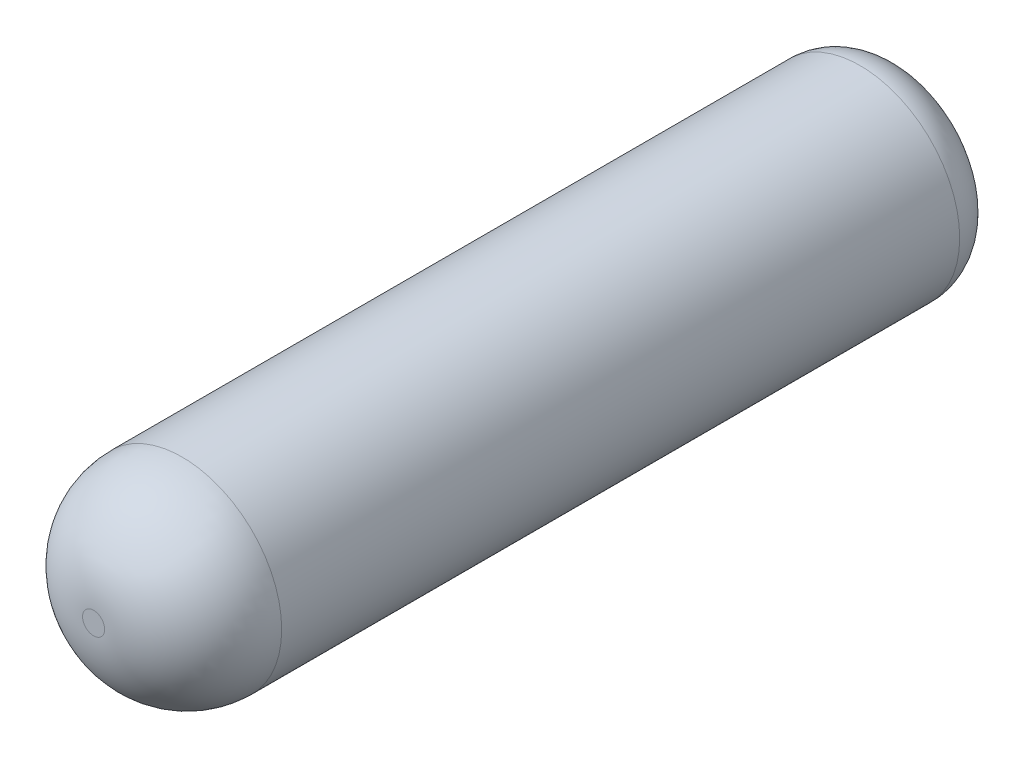
ISO-10303-21;
HEADER;
FILE_DESCRIPTION(('STEP AP214'),'2;1');
FILE_NAME('part.step','',(''),(''),'','','');
FILE_SCHEMA(('AUTOMOTIVE_DESIGN { 1 0 10303 214 1 1 1 1 }'));
ENDSEC;
DATA;
#1=APPLICATION_CONTEXT('core data for automotive mechanical design processes');
#2=APPLICATION_PROTOCOL_DEFINITION('international standard','automotive_design',2000,#1);
#3=PRODUCT_CONTEXT('',#1,'mechanical');
#4=PRODUCT('Part','Part','',(#3));
#5=PRODUCT_RELATED_PRODUCT_CATEGORY('part','',(#4));
#6=PRODUCT_DEFINITION_FORMATION('','',#4);
#7=PRODUCT_DEFINITION_CONTEXT('part definition',#1,'design');
#8=PRODUCT_DEFINITION('design','',#6,#7);
#9=PRODUCT_DEFINITION_SHAPE('','',#8);
#10=(LENGTH_UNIT() NAMED_UNIT(*) SI_UNIT(.MILLI.,.METRE.));
#11=(NAMED_UNIT(*) PLANE_ANGLE_UNIT() SI_UNIT($,.RADIAN.));
#12=(NAMED_UNIT(*) SI_UNIT($,.STERADIAN.) SOLID_ANGLE_UNIT());
#13=UNCERTAINTY_MEASURE_WITH_UNIT(LENGTH_MEASURE(1.E-05),#10,'distance_accuracy_value','');
#14=(GEOMETRIC_REPRESENTATION_CONTEXT(3) GLOBAL_UNCERTAINTY_ASSIGNED_CONTEXT((#13)) GLOBAL_UNIT_ASSIGNED_CONTEXT((#10,
#11,#12)) REPRESENTATION_CONTEXT('',''));
#15=CARTESIAN_POINT('',(0.,0.,0.));
#16=DIRECTION('',(0.,0.,1.));
#17=DIRECTION('',(1.,0.,0.));
#18=AXIS2_PLACEMENT_3D('',#15,#16,#17);
#19=CARTESIAN_POINT('',(0.,0.,116.332));
#20=DIRECTION('',(0.,0.,-1.));
#21=DIRECTION('',(-1.,0.,0.));
#22=AXIS2_PLACEMENT_3D('',#19,#20,#21);
#23=CYLINDRICAL_SURFACE('',#22,14.2875);
#24=CARTESIAN_POINT('',(0.,0.,103.632));
#25=DIRECTION('',(0.,0.,1.));
#26=DIRECTION('',(1.,0.,0.));
#27=AXIS2_PLACEMENT_3D('',#24,#25,#26);
#28=CIRCLE('',#27,14.2875);
#29=CARTESIAN_POINT('',(-14.2875,0.,103.632));
#30=VERTEX_POINT('',#29);
#31=EDGE_CURVE('E10',#30,#30,#28,.F.);
#32=CARTESIAN_POINT('',(0.,0.,6.34999999999997));
#33=DIRECTION('',(0.,0.,1.));
#34=DIRECTION('',(1.,0.,0.));
#35=AXIS2_PLACEMENT_3D('',#32,#33,#34);
#36=CIRCLE('',#35,14.2875);
#37=CARTESIAN_POINT('',(-14.2875,0.,6.34999999999997));
#38=VERTEX_POINT('',#37);
#39=EDGE_CURVE('E61',#38,#38,#36,.T.);
#40=CARTESIAN_POINT('',(-14.2875,0.,103.632));
#41=CARTESIAN_POINT('',(-14.2875,0.,102.618645833333));
#42=CARTESIAN_POINT('',(-14.2875,0.,101.605291666667));
#43=CARTESIAN_POINT('',(-14.2875,0.,99.5785833333333));
#44=CARTESIAN_POINT('',(-14.2875,0.,98.5652291666667));
#45=CARTESIAN_POINT('',(-14.2875,0.,96.5385208333333));
#46=CARTESIAN_POINT('',(-14.2875,0.,95.5251666666667));
#47=CARTESIAN_POINT('',(-14.2875,0.,93.4984583333333));
#48=CARTESIAN_POINT('',(-14.2875,0.,92.4851041666666));
#49=CARTESIAN_POINT('',(-14.2875,0.,90.4583958333333));
#50=CARTESIAN_POINT('',(-14.2875,0.,89.4450416666667));
#51=CARTESIAN_POINT('',(-14.2875,0.,87.4183333333333));
#52=CARTESIAN_POINT('',(-14.2875,0.,86.4049791666667));
#53=CARTESIAN_POINT('',(-14.2875,0.,84.3782708333333));
#54=CARTESIAN_POINT('',(-14.2875,0.,83.3649166666667));
#55=CARTESIAN_POINT('',(-14.2875,0.,81.3382083333333));
#56=CARTESIAN_POINT('',(-14.2875,0.,80.3248541666667));
#57=CARTESIAN_POINT('',(-14.2875,0.,78.2981458333333));
#58=CARTESIAN_POINT('',(-14.2875,0.,77.2847916666666));
#59=CARTESIAN_POINT('',(-14.2875,0.,75.2580833333333));
#60=CARTESIAN_POINT('',(-14.2875,0.,74.2447291666666));
#61=CARTESIAN_POINT('',(-14.2875,0.,72.2180208333333));
#62=CARTESIAN_POINT('',(-14.2875,0.,71.2046666666667));
#63=CARTESIAN_POINT('',(-14.2875,0.,69.1779583333333));
#64=CARTESIAN_POINT('',(-14.2875,0.,68.1646041666667));
#65=CARTESIAN_POINT('',(-14.2875,0.,66.1378958333333));
#66=CARTESIAN_POINT('',(-14.2875,0.,65.1245416666666));
#67=CARTESIAN_POINT('',(-14.2875,0.,63.0978333333333));
#68=CARTESIAN_POINT('',(-14.2875,0.,62.0844791666666));
#69=CARTESIAN_POINT('',(-14.2875,0.,60.0577708333333));
#70=CARTESIAN_POINT('',(-14.2875,0.,59.0444166666667));
#71=CARTESIAN_POINT('',(-14.2875,0.,57.0177083333333));
#72=CARTESIAN_POINT('',(-14.2875,0.,56.0043541666666));
#73=CARTESIAN_POINT('',(-14.2875,0.,53.9776458333333));
#74=CARTESIAN_POINT('',(-14.2875,0.,52.9642916666666));
#75=CARTESIAN_POINT('',(-14.2875,0.,50.9375833333333));
#76=CARTESIAN_POINT('',(-14.2875,0.,49.9242291666666));
#77=CARTESIAN_POINT('',(-14.2875,0.,47.8975208333333));
#78=CARTESIAN_POINT('',(-14.2875,0.,46.8841666666667));
#79=CARTESIAN_POINT('',(-14.2875,0.,44.8574583333333));
#80=CARTESIAN_POINT('',(-14.2875,0.,43.8441041666667));
#81=CARTESIAN_POINT('',(-14.2875,0.,41.8173958333333));
#82=CARTESIAN_POINT('',(-14.2875,0.,40.8040416666666));
#83=CARTESIAN_POINT('',(-14.2875,0.,38.7773333333333));
#84=CARTESIAN_POINT('',(-14.2875,0.,37.7639791666667));
#85=CARTESIAN_POINT('',(-14.2875,0.,35.7372708333333));
#86=CARTESIAN_POINT('',(-14.2875,0.,34.7239166666666));
#87=CARTESIAN_POINT('',(-14.2875,0.,32.6972083333333));
#88=CARTESIAN_POINT('',(-14.2875,0.,31.6838541666666));
#89=CARTESIAN_POINT('',(-14.2875,0.,29.6571458333333));
#90=CARTESIAN_POINT('',(-14.2875,0.,28.6437916666666));
#91=CARTESIAN_POINT('',(-14.2875,0.,26.6170833333333));
#92=CARTESIAN_POINT('',(-14.2875,0.,25.6037291666666));
#93=CARTESIAN_POINT('',(-14.2875,0.,23.5770208333333));
#94=CARTESIAN_POINT('',(-14.2875,0.,22.5636666666666));
#95=CARTESIAN_POINT('',(-14.2875,0.,20.5369583333333));
#96=CARTESIAN_POINT('',(-14.2875,0.,19.5236041666666));
#97=CARTESIAN_POINT('',(-14.2875,0.,17.4968958333333));
#98=CARTESIAN_POINT('',(-14.2875,0.,16.4835416666666));
#99=CARTESIAN_POINT('',(-14.2875,0.,14.4568333333333));
#100=CARTESIAN_POINT('',(-14.2875,0.,13.4434791666666));
#101=CARTESIAN_POINT('',(-14.2875,0.,11.4167708333333));
#102=CARTESIAN_POINT('',(-14.2875,0.,10.4034166666666));
#103=CARTESIAN_POINT('',(-14.2875,0.,8.3767083333333));
#104=CARTESIAN_POINT('',(-14.2875,0.,7.36335416666663));
#105=CARTESIAN_POINT('',(-14.2875,0.,6.34999999999997));
#106=B_SPLINE_CURVE_WITH_KNOTS('',3,(#40,#41,#42,#43,#44,#45,#46,#47,#48,#49,#50,#51,#52,#53,
#54,#55,#56,#57,#58,#59,#60,#61,#62,#63,#64,#65,#66,#67,#68,#69,#70,#71,#72,#73,#74,#75,#76,#77,
#78,#79,#80,#81,#82,#83,#84,#85,#86,#87,#88,#89,#90,#91,#92,#93,#94,#95,#96,#97,#98,#99,#100,
#101,#102,#103,#104,#105),.UNSPECIFIED.,.F.,.F.,(4,2,2,2,2,2,2,2,2,2,2,2,2,2,2,2,2,2,2,2,2,2,2,
2,2,2,2,2,2,2,2,2,4),(0.,3.0400625,6.08012499999999,9.1201875,12.16025,15.2003125,18.240375,
21.2804375,24.3205,27.3605625,30.400625,33.4406875,36.48075,39.5208125,42.560875,45.6009375,
48.641,51.6810625,54.721125,57.7611875,60.80125,63.8413125,66.881375,69.9214375,72.9615,
76.0015625,79.041625,82.0816875,85.12175,88.1618125,91.201875,94.2419375,97.282),.UNSPECIFIED.);
#107=EDGE_CURVE('BSEAM43',#30,#38,#106,.T.);
#108=ORIENTED_EDGE('',*,*,#31,.T.);
#109=ORIENTED_EDGE('',*,*,#39,.T.);
#110=ORIENTED_EDGE('',*,*,#107,.T.);
#111=ORIENTED_EDGE('',*,*,#107,.F.);
#112=EDGE_LOOP('',(#108,#110,#109,#111));
#113=FACE_BOUND('',#112,.T.);
#114=ADVANCED_FACE('F43',(#113),#23,.T.);
#115=CARTESIAN_POINT('',(0.,0.,116.332));
#116=DIRECTION('',(0.,0.,1.));
#117=DIRECTION('',(1.,0.,0.));
#118=AXIS2_PLACEMENT_3D('',#115,#116,#117);
#119=PLANE('',#118);
#120=CARTESIAN_POINT('',(0.,0.,116.332));
#121=DIRECTION('',(0.,0.,1.));
#122=DIRECTION('',(1.,0.,0.));
#123=AXIS2_PLACEMENT_3D('',#120,#121,#122);
#124=CIRCLE('',#123,1.5875);
#125=CARTESIAN_POINT('',(1.5875,0.,116.332));
#126=VERTEX_POINT('',#125);
#127=EDGE_CURVE('E51',#126,#126,#124,.T.);
#128=ORIENTED_EDGE('',*,*,#127,.T.);
#129=EDGE_LOOP('',(#128));
#130=FACE_BOUND('',#129,.T.);
#131=ADVANCED_FACE('F79',(#130),#119,.T.);
#132=CARTESIAN_POINT('',(0.,0.,0.));
#133=DIRECTION('',(0.,0.,1.));
#134=DIRECTION('',(1.,0.,0.));
#135=AXIS2_PLACEMENT_3D('',#132,#133,#134);
#136=PLANE('',#135);
#137=CARTESIAN_POINT('',(0.,0.,0.));
#138=DIRECTION('',(0.,0.,1.));
#139=DIRECTION('',(1.,0.,0.));
#140=AXIS2_PLACEMENT_3D('',#137,#138,#139);
#141=CIRCLE('',#140,7.9375);
#142=CARTESIAN_POINT('',(7.9375,0.,0.));
#143=VERTEX_POINT('',#142);
#144=EDGE_CURVE('E56',#143,#143,#141,.F.);
#145=ORIENTED_EDGE('',*,*,#144,.T.);
#146=EDGE_LOOP('',(#145));
#147=FACE_BOUND('',#146,.T.);
#148=ADVANCED_FACE('F71',(#147),#136,.F.);
#149=CARTESIAN_POINT('',(0.,0.,6.34999999999999));
#150=DIRECTION('',(0.,0.,1.));
#151=DIRECTION('',(1.,0.,0.));
#152=AXIS2_PLACEMENT_3D('',#149,#150,#151);
#153=TOROIDAL_SURFACE('',#152,7.9375,6.35);
#154=ORIENTED_EDGE('',*,*,#144,.F.);
#155=EDGE_LOOP('',(#154));
#156=FACE_BOUND('',#155,.T.);
#157=ORIENTED_EDGE('',*,*,#39,.F.);
#158=EDGE_LOOP('',(#157));
#159=FACE_BOUND('',#158,.T.);
#160=ADVANCED_FACE('F69',(#156,#159),#153,.T.);
#161=CARTESIAN_POINT('',(0.,0.,103.632));
#162=DIRECTION('',(0.,0.,1.));
#163=DIRECTION('',(1.,0.,0.));
#164=AXIS2_PLACEMENT_3D('',#161,#162,#163);
#165=DEGENERATE_TOROIDAL_SURFACE('',#164,1.5875,12.7,.T.);
#166=ORIENTED_EDGE('',*,*,#31,.F.);
#167=EDGE_LOOP('',(#166));
#168=FACE_BOUND('',#167,.T.);
#169=ORIENTED_EDGE('',*,*,#127,.F.);
#170=EDGE_LOOP('',(#169));
#171=FACE_BOUND('',#170,.T.);
#172=ADVANCED_FACE('F45',(#168,#171),#165,.T.);
#173=CLOSED_SHELL('',(#114,#131,#148,#160,#172));
#174=MANIFOLD_SOLID_BREP('B2',#173);
#175=ADVANCED_BREP_SHAPE_REPRESENTATION('',(#18,#174),#14);
#176=SHAPE_DEFINITION_REPRESENTATION(#9,#175);
ENDSEC;
END-ISO-10303-21;
